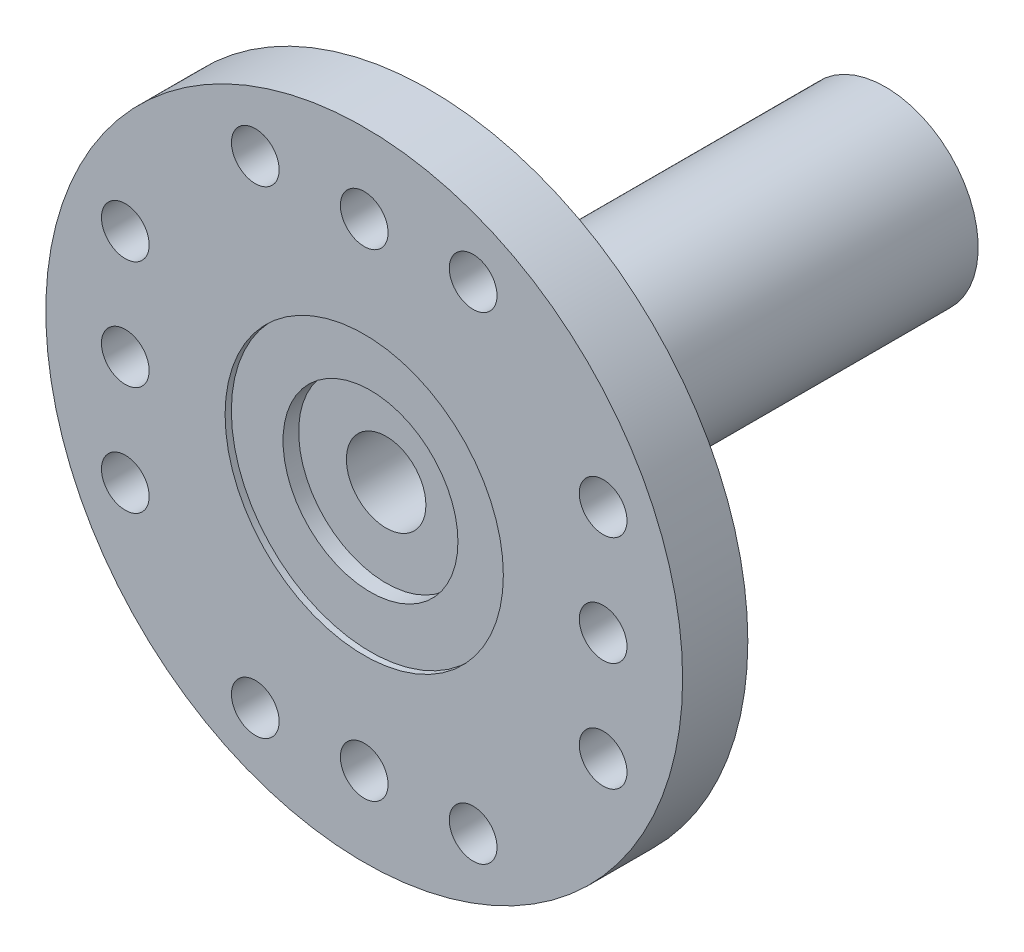
ISO-10303-21;
HEADER;
FILE_DESCRIPTION(('STEP AP214'),'2;1');
FILE_NAME('part.step','',(''),(''),'','','');
FILE_SCHEMA(('AUTOMOTIVE_DESIGN { 1 0 10303 214 1 1 1 1 }'));
ENDSEC;
DATA;
#1=APPLICATION_CONTEXT('core data for automotive mechanical design processes');
#2=APPLICATION_PROTOCOL_DEFINITION('international standard','automotive_design',2000,#1);
#3=PRODUCT_CONTEXT('',#1,'mechanical');
#4=PRODUCT('Part','Part','',(#3));
#5=PRODUCT_RELATED_PRODUCT_CATEGORY('part','',(#4));
#6=PRODUCT_DEFINITION_FORMATION('','',#4);
#7=PRODUCT_DEFINITION_CONTEXT('part definition',#1,'design');
#8=PRODUCT_DEFINITION('design','',#6,#7);
#9=PRODUCT_DEFINITION_SHAPE('','',#8);
#10=(LENGTH_UNIT() NAMED_UNIT(*) SI_UNIT(.MILLI.,.METRE.));
#11=(NAMED_UNIT(*) PLANE_ANGLE_UNIT() SI_UNIT($,.RADIAN.));
#12=(NAMED_UNIT(*) SI_UNIT($,.STERADIAN.) SOLID_ANGLE_UNIT());
#13=UNCERTAINTY_MEASURE_WITH_UNIT(LENGTH_MEASURE(1.E-05),#10,'distance_accuracy_value','');
#14=(GEOMETRIC_REPRESENTATION_CONTEXT(3) GLOBAL_UNCERTAINTY_ASSIGNED_CONTEXT((#13)) GLOBAL_UNIT_ASSIGNED_CONTEXT((#10,
#11,#12)) REPRESENTATION_CONTEXT('',''));
#15=CARTESIAN_POINT('',(0.,0.,0.));
#16=DIRECTION('',(0.,0.,1.));
#17=DIRECTION('',(1.,0.,0.));
#18=AXIS2_PLACEMENT_3D('',#15,#16,#17);
#19=CARTESIAN_POINT('',(0.,0.,-3.302));
#20=DIRECTION('',(0.,0.,-1.));
#21=DIRECTION('',(-1.,0.,0.));
#22=AXIS2_PLACEMENT_3D('',#19,#20,#21);
#23=PLANE('',#22);
#24=CARTESIAN_POINT('',(0.,0.,-3.302));
#25=DIRECTION('',(0.,0.,-1.));
#26=DIRECTION('',(-1.,0.,0.));
#27=AXIS2_PLACEMENT_3D('',#24,#25,#26);
#28=CIRCLE('',#27,4.699);
#29=CARTESIAN_POINT('',(4.699,0.,-3.302));
#30=VERTEX_POINT('',#29);
#31=EDGE_CURVE('E46',#30,#30,#28,.T.);
#32=ORIENTED_EDGE('',*,*,#31,.T.);
#33=EDGE_LOOP('',(#32));
#34=FACE_BOUND('',#33,.T.);
#35=CARTESIAN_POINT('',(0.,0.,-3.302));
#36=DIRECTION('',(0.,0.,-1.));
#37=DIRECTION('',(-1.,0.,0.));
#38=AXIS2_PLACEMENT_3D('',#35,#36,#37);
#39=CIRCLE('',#38,2.9591);
#40=CARTESIAN_POINT('',(-2.9591,0.,-3.302));
#41=VERTEX_POINT('',#40);
#42=EDGE_CURVE('E51',#41,#41,#39,.T.);
#43=ORIENTED_EDGE('',*,*,#42,.F.);
#44=EDGE_LOOP('',(#43));
#45=FACE_BOUND('',#44,.T.);
#46=ADVANCED_FACE('F30',(#34,#45),#23,.T.);
#47=CARTESIAN_POINT('',(0.,0.,0.));
#48=DIRECTION('',(0.,0.,1.));
#49=DIRECTION('',(1.,0.,0.));
#50=AXIS2_PLACEMENT_3D('',#47,#48,#49);
#51=PLANE('',#50);
#52=CARTESIAN_POINT('',(3.47980000000008,-7.63269999999996,0.));
#53=DIRECTION('',(0.,0.,1.));
#54=DIRECTION('',(1.,0.,0.));
#55=AXIS2_PLACEMENT_3D('',#52,#53,#54);
#56=CIRCLE('',#55,0.762000000000002);
#57=CARTESIAN_POINT('',(4.24180000000008,-7.63269999999996,0.));
#58=VERTEX_POINT('',#57);
#59=EDGE_CURVE('E140',#58,#58,#56,.F.);
#60=ORIENTED_EDGE('',*,*,#59,.F.);
#61=EDGE_LOOP('',(#60));
#62=FACE_BOUND('',#61,.T.);
#63=CARTESIAN_POINT('',(-3.47979999999992,-7.63270000000004,0.));
#64=DIRECTION('',(0.,0.,1.));
#65=DIRECTION('',(1.,0.,0.));
#66=AXIS2_PLACEMENT_3D('',#63,#64,#65);
#67=CIRCLE('',#66,0.762000000000001);
#68=CARTESIAN_POINT('',(-2.71779999999992,-7.63270000000004,0.));
#69=VERTEX_POINT('',#68);
#70=EDGE_CURVE('E134',#69,#69,#67,.F.);
#71=ORIENTED_EDGE('',*,*,#70,.F.);
#72=EDGE_LOOP('',(#71));
#73=FACE_BOUND('',#72,.T.);
#74=CARTESIAN_POINT('',(0.,-7.6327,0.));
#75=DIRECTION('',(0.,0.,1.));
#76=DIRECTION('',(1.,0.,0.));
#77=AXIS2_PLACEMENT_3D('',#74,#75,#76);
#78=CIRCLE('',#77,0.762000000000001);
#79=CARTESIAN_POINT('',(0.762000000000081,-7.6327,0.));
#80=VERTEX_POINT('',#79);
#81=EDGE_CURVE('E128',#80,#80,#78,.F.);
#82=ORIENTED_EDGE('',*,*,#81,.F.);
#83=EDGE_LOOP('',(#82));
#84=FACE_BOUND('',#83,.T.);
#85=CARTESIAN_POINT('',(-7.63269999999998,-3.47980000000005,0.));
#86=DIRECTION('',(0.,0.,1.));
#87=DIRECTION('',(1.,0.,0.));
#88=AXIS2_PLACEMENT_3D('',#85,#86,#87);
#89=CIRCLE('',#88,0.762000000000002);
#90=CARTESIAN_POINT('',(-6.87069999999997,-3.47980000000005,0.));
#91=VERTEX_POINT('',#90);
#92=EDGE_CURVE('E122',#91,#91,#89,.F.);
#93=ORIENTED_EDGE('',*,*,#92,.F.);
#94=EDGE_LOOP('',(#93));
#95=FACE_BOUND('',#94,.T.);
#96=CARTESIAN_POINT('',(-7.63270000000002,3.47979999999995,0.));
#97=DIRECTION('',(0.,0.,1.));
#98=DIRECTION('',(1.,0.,0.));
#99=AXIS2_PLACEMENT_3D('',#96,#97,#98);
#100=CIRCLE('',#99,0.762000000000001);
#101=CARTESIAN_POINT('',(-6.87070000000002,3.47979999999995,0.));
#102=VERTEX_POINT('',#101);
#103=EDGE_CURVE('E116',#102,#102,#100,.F.);
#104=ORIENTED_EDGE('',*,*,#103,.F.);
#105=EDGE_LOOP('',(#104));
#106=FACE_BOUND('',#105,.T.);
#107=CARTESIAN_POINT('',(-7.6327,0.,0.));
#108=DIRECTION('',(0.,0.,1.));
#109=DIRECTION('',(1.,0.,0.));
#110=AXIS2_PLACEMENT_3D('',#107,#108,#109);
#111=CIRCLE('',#110,0.762000000000001);
#112=CARTESIAN_POINT('',(-6.8707,0.,0.));
#113=VERTEX_POINT('',#112);
#114=EDGE_CURVE('E110',#113,#113,#111,.F.);
#115=ORIENTED_EDGE('',*,*,#114,.F.);
#116=EDGE_LOOP('',(#115));
#117=FACE_BOUND('',#116,.T.);
#118=CARTESIAN_POINT('',(-3.47980000000003,7.63269999999999,0.));
#119=DIRECTION('',(0.,0.,1.));
#120=DIRECTION('',(1.,0.,0.));
#121=AXIS2_PLACEMENT_3D('',#118,#119,#120);
#122=CIRCLE('',#121,0.762000000000002);
#123=CARTESIAN_POINT('',(-2.71780000000002,7.63269999999999,0.));
#124=VERTEX_POINT('',#123);
#125=EDGE_CURVE('E104',#124,#124,#122,.F.);
#126=ORIENTED_EDGE('',*,*,#125,.F.);
#127=EDGE_LOOP('',(#126));
#128=FACE_BOUND('',#127,.T.);
#129=CARTESIAN_POINT('',(3.47979999999997,7.63270000000001,0.));
#130=DIRECTION('',(0.,0.,1.));
#131=DIRECTION('',(1.,0.,0.));
#132=AXIS2_PLACEMENT_3D('',#129,#130,#131);
#133=CIRCLE('',#132,0.762000000000001);
#134=CARTESIAN_POINT('',(4.24179999999997,7.63270000000001,0.));
#135=VERTEX_POINT('',#134);
#136=EDGE_CURVE('E98',#135,#135,#133,.F.);
#137=ORIENTED_EDGE('',*,*,#136,.F.);
#138=EDGE_LOOP('',(#137));
#139=FACE_BOUND('',#138,.T.);
#140=CARTESIAN_POINT('',(0.,7.6327,0.));
#141=DIRECTION('',(0.,0.,1.));
#142=DIRECTION('',(1.,0.,0.));
#143=AXIS2_PLACEMENT_3D('',#140,#141,#142);
#144=CIRCLE('',#143,0.762000000000001);
#145=CARTESIAN_POINT('',(0.761999999999974,7.6327,0.));
#146=VERTEX_POINT('',#145);
#147=EDGE_CURVE('E92',#146,#146,#144,.F.);
#148=ORIENTED_EDGE('',*,*,#147,.F.);
#149=EDGE_LOOP('',(#148));
#150=FACE_BOUND('',#149,.T.);
#151=CARTESIAN_POINT('',(7.6327,3.4798,0.));
#152=DIRECTION('',(0.,0.,1.));
#153=DIRECTION('',(1.,0.,0.));
#154=AXIS2_PLACEMENT_3D('',#151,#152,#153);
#155=CIRCLE('',#154,0.762000000000002);
#156=CARTESIAN_POINT('',(8.3947,3.4798,0.));
#157=VERTEX_POINT('',#156);
#158=EDGE_CURVE('E86',#157,#157,#155,.F.);
#159=ORIENTED_EDGE('',*,*,#158,.F.);
#160=EDGE_LOOP('',(#159));
#161=FACE_BOUND('',#160,.T.);
#162=CARTESIAN_POINT('',(7.6327,-3.4798,0.));
#163=DIRECTION('',(0.,0.,1.));
#164=DIRECTION('',(1.,0.,0.));
#165=AXIS2_PLACEMENT_3D('',#162,#163,#164);
#166=CIRCLE('',#165,0.762000000000001);
#167=CARTESIAN_POINT('',(8.3947,-3.4798,0.));
#168=VERTEX_POINT('',#167);
#169=EDGE_CURVE('E80',#168,#168,#166,.F.);
#170=ORIENTED_EDGE('',*,*,#169,.F.);
#171=EDGE_LOOP('',(#170));
#172=FACE_BOUND('',#171,.T.);
#173=CARTESIAN_POINT('',(7.6327,0.,0.));
#174=DIRECTION('',(0.,0.,1.));
#175=DIRECTION('',(1.,0.,0.));
#176=AXIS2_PLACEMENT_3D('',#173,#174,#175);
#177=CIRCLE('',#176,0.762000000000001);
#178=CARTESIAN_POINT('',(8.3947,0.,0.));
#179=VERTEX_POINT('',#178);
#180=EDGE_CURVE('E72',#179,#179,#177,.F.);
#181=ORIENTED_EDGE('',*,*,#180,.F.);
#182=EDGE_LOOP('',(#181));
#183=FACE_BOUND('',#182,.T.);
#184=CARTESIAN_POINT('',(0.,0.,0.));
#185=DIRECTION('',(0.,0.,1.));
#186=DIRECTION('',(1.,0.,0.));
#187=AXIS2_PLACEMENT_3D('',#184,#185,#186);
#188=CIRCLE('',#187,10.1727);
#189=CARTESIAN_POINT('',(10.1727,0.,0.));
#190=VERTEX_POINT('',#189);
#191=EDGE_CURVE('E41',#190,#190,#188,.T.);
#192=ORIENTED_EDGE('',*,*,#191,.F.);
#193=EDGE_LOOP('',(#192));
#194=FACE_BOUND('',#193,.T.);
#195=CARTESIAN_POINT('',(0.,0.,0.));
#196=DIRECTION('',(0.,0.,1.));
#197=DIRECTION('',(1.,0.,0.));
#198=AXIS2_PLACEMENT_3D('',#195,#196,#197);
#199=CIRCLE('',#198,4.699);
#200=CARTESIAN_POINT('',(4.699,0.,0.));
#201=VERTEX_POINT('',#200);
#202=EDGE_CURVE('E10',#201,#201,#199,.F.);
#203=ORIENTED_EDGE('',*,*,#202,.F.);
#204=EDGE_LOOP('',(#203));
#205=FACE_BOUND('',#204,.T.);
#206=ADVANCED_FACE('F197',(#62,#73,#84,#95,#106,#117,#128,#139,#150,#161,#172,#183,#194,#205),
#51,.F.);
#207=CARTESIAN_POINT('',(0.,0.,2.0828));
#208=DIRECTION('',(0.,0.,-1.));
#209=DIRECTION('',(-1.,0.,0.));
#210=AXIS2_PLACEMENT_3D('',#207,#208,#209);
#211=CYLINDRICAL_SURFACE('',#210,10.1727);
#212=CARTESIAN_POINT('',(0.,0.,2.0828));
#213=DIRECTION('',(0.,0.,1.));
#214=DIRECTION('',(1.,0.,0.));
#215=AXIS2_PLACEMENT_3D('',#212,#213,#214);
#216=CIRCLE('',#215,10.1727);
#217=CARTESIAN_POINT('',(10.1727,0.,2.0828));
#218=VERTEX_POINT('',#217);
#219=EDGE_CURVE('E37',#218,#218,#216,.T.);
#220=ORIENTED_EDGE('',*,*,#219,.F.);
#221=EDGE_LOOP('',(#220));
#222=FACE_BOUND('',#221,.T.);
#223=ORIENTED_EDGE('',*,*,#191,.T.);
#224=EDGE_LOOP('',(#223));
#225=FACE_BOUND('',#224,.T.);
#226=ADVANCED_FACE('F32',(#222,#225),#211,.T.);
#227=CARTESIAN_POINT('',(0.,0.,2.0828));
#228=DIRECTION('',(0.,0.,1.));
#229=DIRECTION('',(1.,0.,0.));
#230=AXIS2_PLACEMENT_3D('',#227,#228,#229);
#231=PLANE('',#230);
#232=CARTESIAN_POINT('',(3.47980000000008,-7.63269999999996,2.0828));
#233=DIRECTION('',(0.,0.,1.));
#234=DIRECTION('',(0.,-1.,0.));
#235=AXIS2_PLACEMENT_3D('',#232,#233,#234);
#236=CIRCLE('',#235,0.762000000000002);
#237=CARTESIAN_POINT('',(3.47980000000009,-8.39469999999996,2.0828));
#238=VERTEX_POINT('',#237);
#239=EDGE_CURVE('E143',#238,#238,#236,.T.);
#240=ORIENTED_EDGE('',*,*,#239,.F.);
#241=EDGE_LOOP('',(#240));
#242=FACE_BOUND('',#241,.T.);
#243=CARTESIAN_POINT('',(-3.47979999999992,-7.63270000000004,2.0828));
#244=DIRECTION('',(0.,0.,1.));
#245=DIRECTION('',(0.,-1.,0.));
#246=AXIS2_PLACEMENT_3D('',#243,#244,#245);
#247=CIRCLE('',#246,0.762000000000001);
#248=CARTESIAN_POINT('',(-3.47979999999991,-8.39470000000004,2.0828));
#249=VERTEX_POINT('',#248);
#250=EDGE_CURVE('E137',#249,#249,#247,.T.);
#251=ORIENTED_EDGE('',*,*,#250,.F.);
#252=EDGE_LOOP('',(#251));
#253=FACE_BOUND('',#252,.T.);
#254=CARTESIAN_POINT('',(0.,-7.6327,2.0828));
#255=DIRECTION('',(0.,0.,1.));
#256=DIRECTION('',(0.,-1.,0.));
#257=AXIS2_PLACEMENT_3D('',#254,#255,#256);
#258=CIRCLE('',#257,0.762000000000001);
#259=CARTESIAN_POINT('',(0.,-8.3947,2.0828));
#260=VERTEX_POINT('',#259);
#261=EDGE_CURVE('E131',#260,#260,#258,.T.);
#262=ORIENTED_EDGE('',*,*,#261,.F.);
#263=EDGE_LOOP('',(#262));
#264=FACE_BOUND('',#263,.T.);
#265=CARTESIAN_POINT('',(-7.63269999999998,-3.47980000000005,2.0828));
#266=DIRECTION('',(0.,0.,1.));
#267=DIRECTION('',(-1.,0.,0.));
#268=AXIS2_PLACEMENT_3D('',#265,#266,#267);
#269=CIRCLE('',#268,0.762000000000002);
#270=CARTESIAN_POINT('',(-8.39469999999998,-3.47980000000006,2.0828));
#271=VERTEX_POINT('',#270);
#272=EDGE_CURVE('E125',#271,#271,#269,.T.);
#273=ORIENTED_EDGE('',*,*,#272,.F.);
#274=EDGE_LOOP('',(#273));
#275=FACE_BOUND('',#274,.T.);
#276=CARTESIAN_POINT('',(-7.63270000000002,3.47979999999995,2.0828));
#277=DIRECTION('',(0.,0.,1.));
#278=DIRECTION('',(-1.,0.,0.));
#279=AXIS2_PLACEMENT_3D('',#276,#277,#278);
#280=CIRCLE('',#279,0.762000000000001);
#281=CARTESIAN_POINT('',(-8.39470000000002,3.47979999999994,2.0828));
#282=VERTEX_POINT('',#281);
#283=EDGE_CURVE('E119',#282,#282,#280,.T.);
#284=ORIENTED_EDGE('',*,*,#283,.F.);
#285=EDGE_LOOP('',(#284));
#286=FACE_BOUND('',#285,.T.);
#287=CARTESIAN_POINT('',(-7.6327,0.,2.0828));
#288=DIRECTION('',(0.,0.,1.));
#289=DIRECTION('',(-1.,0.,0.));
#290=AXIS2_PLACEMENT_3D('',#287,#288,#289);
#291=CIRCLE('',#290,0.762000000000001);
#292=CARTESIAN_POINT('',(-8.3947,0.,2.0828));
#293=VERTEX_POINT('',#292);
#294=EDGE_CURVE('E113',#293,#293,#291,.T.);
#295=ORIENTED_EDGE('',*,*,#294,.F.);
#296=EDGE_LOOP('',(#295));
#297=FACE_BOUND('',#296,.T.);
#298=CARTESIAN_POINT('',(-3.47980000000003,7.63269999999999,2.0828));
#299=DIRECTION('',(0.,0.,1.));
#300=DIRECTION('',(0.,1.,0.));
#301=AXIS2_PLACEMENT_3D('',#298,#299,#300);
#302=CIRCLE('',#301,0.762000000000002);
#303=CARTESIAN_POINT('',(-3.47980000000003,8.39469999999999,2.0828));
#304=VERTEX_POINT('',#303);
#305=EDGE_CURVE('E107',#304,#304,#302,.T.);
#306=ORIENTED_EDGE('',*,*,#305,.F.);
#307=EDGE_LOOP('',(#306));
#308=FACE_BOUND('',#307,.T.);
#309=CARTESIAN_POINT('',(3.47979999999997,7.63270000000001,2.0828));
#310=DIRECTION('',(0.,0.,1.));
#311=DIRECTION('',(0.,1.,0.));
#312=AXIS2_PLACEMENT_3D('',#309,#310,#311);
#313=CIRCLE('',#312,0.762000000000001);
#314=CARTESIAN_POINT('',(3.47979999999997,8.39470000000001,2.0828));
#315=VERTEX_POINT('',#314);
#316=EDGE_CURVE('E101',#315,#315,#313,.T.);
#317=ORIENTED_EDGE('',*,*,#316,.F.);
#318=EDGE_LOOP('',(#317));
#319=FACE_BOUND('',#318,.T.);
#320=CARTESIAN_POINT('',(0.,7.6327,2.0828));
#321=DIRECTION('',(0.,0.,1.));
#322=DIRECTION('',(0.,1.,0.));
#323=AXIS2_PLACEMENT_3D('',#320,#321,#322);
#324=CIRCLE('',#323,0.762000000000001);
#325=CARTESIAN_POINT('',(0.,8.3947,2.0828));
#326=VERTEX_POINT('',#325);
#327=EDGE_CURVE('E95',#326,#326,#324,.T.);
#328=ORIENTED_EDGE('',*,*,#327,.F.);
#329=EDGE_LOOP('',(#328));
#330=FACE_BOUND('',#329,.T.);
#331=CARTESIAN_POINT('',(7.6327,3.4798,2.0828));
#332=DIRECTION('',(0.,0.,1.));
#333=DIRECTION('',(1.,0.,0.));
#334=AXIS2_PLACEMENT_3D('',#331,#332,#333);
#335=CIRCLE('',#334,0.762000000000002);
#336=CARTESIAN_POINT('',(8.3947,3.4798,2.0828));
#337=VERTEX_POINT('',#336);
#338=EDGE_CURVE('E89',#337,#337,#335,.T.);
#339=ORIENTED_EDGE('',*,*,#338,.F.);
#340=EDGE_LOOP('',(#339));
#341=FACE_BOUND('',#340,.T.);
#342=CARTESIAN_POINT('',(7.6327,-3.4798,2.0828));
#343=DIRECTION('',(0.,0.,1.));
#344=DIRECTION('',(1.,0.,0.));
#345=AXIS2_PLACEMENT_3D('',#342,#343,#344);
#346=CIRCLE('',#345,0.762000000000001);
#347=CARTESIAN_POINT('',(8.3947,-3.4798,2.0828));
#348=VERTEX_POINT('',#347);
#349=EDGE_CURVE('E83',#348,#348,#346,.T.);
#350=ORIENTED_EDGE('',*,*,#349,.F.);
#351=EDGE_LOOP('',(#350));
#352=FACE_BOUND('',#351,.T.);
#353=CARTESIAN_POINT('',(7.6327,0.,2.0828));
#354=DIRECTION('',(0.,0.,1.));
#355=DIRECTION('',(1.,0.,0.));
#356=AXIS2_PLACEMENT_3D('',#353,#354,#355);
#357=CIRCLE('',#356,0.762000000000001);
#358=CARTESIAN_POINT('',(8.3947,0.,2.0828));
#359=VERTEX_POINT('',#358);
#360=EDGE_CURVE('E77',#359,#359,#357,.T.);
#361=ORIENTED_EDGE('',*,*,#360,.F.);
#362=EDGE_LOOP('',(#361));
#363=FACE_BOUND('',#362,.T.);
#364=CARTESIAN_POINT('',(0.,0.,2.0828));
#365=DIRECTION('',(0.,0.,1.));
#366=DIRECTION('',(1.,0.,0.));
#367=AXIS2_PLACEMENT_3D('',#364,#365,#366);
#368=CIRCLE('',#367,4.445);
#369=CARTESIAN_POINT('',(4.445,0.,2.0828));
#370=VERTEX_POINT('',#369);
#371=EDGE_CURVE('E57',#370,#370,#368,.T.);
#372=ORIENTED_EDGE('',*,*,#371,.F.);
#373=EDGE_LOOP('',(#372));
#374=FACE_BOUND('',#373,.T.);
#375=ORIENTED_EDGE('',*,*,#219,.T.);
#376=EDGE_LOOP('',(#375));
#377=FACE_BOUND('',#376,.T.);
#378=ADVANCED_FACE('F150',(#242,#253,#264,#275,#286,#297,#308,#319,#330,#341,#352,#363,#374,
#377),#231,.T.);
#379=CARTESIAN_POINT('',(0.,0.,-3.302));
#380=DIRECTION('',(0.,0.,1.));
#381=DIRECTION('',(1.,0.,0.));
#382=AXIS2_PLACEMENT_3D('',#379,#380,#381);
#383=CYLINDRICAL_SURFACE('',#382,4.699);
#384=CARTESIAN_POINT('',(4.699,0.,-3.302));
#385=CARTESIAN_POINT('',(4.699,0.,-3.26760416666667));
#386=CARTESIAN_POINT('',(4.699,0.,-3.23320833333333));
#387=CARTESIAN_POINT('',(4.699,0.,-3.16441666666667));
#388=CARTESIAN_POINT('',(4.699,0.,-3.13002083333333));
#389=CARTESIAN_POINT('',(4.699,0.,-3.06122916666667));
#390=CARTESIAN_POINT('',(4.699,0.,-3.02683333333333));
#391=CARTESIAN_POINT('',(4.699,0.,-2.95804166666667));
#392=CARTESIAN_POINT('',(4.699,0.,-2.92364583333333));
#393=CARTESIAN_POINT('',(4.699,0.,-2.85485416666667));
#394=CARTESIAN_POINT('',(4.699,0.,-2.82045833333333));
#395=CARTESIAN_POINT('',(4.699,0.,-2.75166666666667));
#396=CARTESIAN_POINT('',(4.699,0.,-2.71727083333333));
#397=CARTESIAN_POINT('',(4.699,0.,-2.64847916666667));
#398=CARTESIAN_POINT('',(4.699,0.,-2.61408333333333));
#399=CARTESIAN_POINT('',(4.699,0.,-2.54529166666667));
#400=CARTESIAN_POINT('',(4.699,0.,-2.51089583333333));
#401=CARTESIAN_POINT('',(4.699,0.,-2.44210416666667));
#402=CARTESIAN_POINT('',(4.699,0.,-2.40770833333333));
#403=CARTESIAN_POINT('',(4.699,0.,-2.33891666666667));
#404=CARTESIAN_POINT('',(4.699,0.,-2.30452083333333));
#405=CARTESIAN_POINT('',(4.699,0.,-2.23572916666667));
#406=CARTESIAN_POINT('',(4.699,0.,-2.20133333333333));
#407=CARTESIAN_POINT('',(4.699,0.,-2.13254166666667));
#408=CARTESIAN_POINT('',(4.699,0.,-2.09814583333333));
#409=CARTESIAN_POINT('',(4.699,0.,-2.02935416666667));
#410=CARTESIAN_POINT('',(4.699,0.,-1.99495833333333));
#411=CARTESIAN_POINT('',(4.699,0.,-1.92616666666667));
#412=CARTESIAN_POINT('',(4.699,0.,-1.89177083333333));
#413=CARTESIAN_POINT('',(4.699,0.,-1.82297916666667));
#414=CARTESIAN_POINT('',(4.699,0.,-1.78858333333333));
#415=CARTESIAN_POINT('',(4.699,0.,-1.71979166666667));
#416=CARTESIAN_POINT('',(4.699,0.,-1.68539583333333));
#417=CARTESIAN_POINT('',(4.699,0.,-1.61660416666667));
#418=CARTESIAN_POINT('',(4.699,0.,-1.58220833333333));
#419=CARTESIAN_POINT('',(4.699,0.,-1.51341666666667));
#420=CARTESIAN_POINT('',(4.699,0.,-1.47902083333333));
#421=CARTESIAN_POINT('',(4.699,0.,-1.41022916666667));
#422=CARTESIAN_POINT('',(4.699,0.,-1.37583333333333));
#423=CARTESIAN_POINT('',(4.699,0.,-1.30704166666667));
#424=CARTESIAN_POINT('',(4.699,0.,-1.27264583333333));
#425=CARTESIAN_POINT('',(4.699,0.,-1.20385416666667));
#426=CARTESIAN_POINT('',(4.699,0.,-1.16945833333333));
#427=CARTESIAN_POINT('',(4.699,0.,-1.10066666666667));
#428=CARTESIAN_POINT('',(4.699,0.,-1.06627083333333));
#429=CARTESIAN_POINT('',(4.699,0.,-0.997479166666667));
#430=CARTESIAN_POINT('',(4.699,0.,-0.963083333333334));
#431=CARTESIAN_POINT('',(4.699,0.,-0.894291666666667));
#432=CARTESIAN_POINT('',(4.699,0.,-0.859895833333333));
#433=CARTESIAN_POINT('',(4.699,0.,-0.791104166666666));
#434=CARTESIAN_POINT('',(4.699,0.,-0.756708333333333));
#435=CARTESIAN_POINT('',(4.699,0.,-0.687916666666667));
#436=CARTESIAN_POINT('',(4.699,0.,-0.653520833333333));
#437=CARTESIAN_POINT('',(4.699,0.,-0.584729166666667));
#438=CARTESIAN_POINT('',(4.699,0.,-0.550333333333333));
#439=CARTESIAN_POINT('',(4.699,0.,-0.481541666666667));
#440=CARTESIAN_POINT('',(4.699,0.,-0.447145833333333));
#441=CARTESIAN_POINT('',(4.699,0.,-0.378354166666667));
#442=CARTESIAN_POINT('',(4.699,0.,-0.343958333333333));
#443=CARTESIAN_POINT('',(4.699,0.,-0.275166666666667));
#444=CARTESIAN_POINT('',(4.699,0.,-0.240770833333333));
#445=CARTESIAN_POINT('',(4.699,0.,-0.171979166666667));
#446=CARTESIAN_POINT('',(4.699,0.,-0.137583333333333));
#447=CARTESIAN_POINT('',(4.699,0.,-0.0687916666666666));
#448=CARTESIAN_POINT('',(4.699,0.,-0.0343958333333333));
#449=CARTESIAN_POINT('',(4.699,0.,0.));
#450=B_SPLINE_CURVE_WITH_KNOTS('',3,(#384,#385,#386,#387,#388,#389,#390,#391,#392,#393,#394,
#395,#396,#397,#398,#399,#400,#401,#402,#403,#404,#405,#406,#407,#408,#409,#410,#411,#412,#413,
#414,#415,#416,#417,#418,#419,#420,#421,#422,#423,#424,#425,#426,#427,#428,#429,#430,#431,#432,
#433,#434,#435,#436,#437,#438,#439,#440,#441,#442,#443,#444,#445,#446,#447,#448,#449),
.UNSPECIFIED.,.F.,.F.,(4,2,2,2,2,2,2,2,2,2,2,2,2,2,2,2,2,2,2,2,2,2,2,2,2,2,2,2,2,2,2,2,4),(0.,
0.1031875,0.206375,0.3095625,0.41275,0.5159375,0.619125,0.7223125,0.8255,0.9286875,1.031875,
1.1350625,1.23825,1.3414375,1.444625,1.5478125,1.651,1.7541875,1.857375,1.9605625,2.06375,
2.1669375,2.270125,2.3733125,2.4765,2.5796875,2.682875,2.7860625,2.88925,2.9924375,3.095625,
3.1988125,3.302),.UNSPECIFIED.);
#451=EDGE_CURVE('BSEAM153',#30,#201,#450,.T.);
#452=ORIENTED_EDGE('',*,*,#31,.F.);
#453=ORIENTED_EDGE('',*,*,#202,.T.);
#454=ORIENTED_EDGE('',*,*,#451,.T.);
#455=ORIENTED_EDGE('',*,*,#451,.F.);
#456=EDGE_LOOP('',(#452,#454,#453,#455));
#457=FACE_BOUND('',#456,.T.);
#458=ADVANCED_FACE('F153',(#457),#383,.T.);
#459=CARTESIAN_POINT('',(0.,0.,-14.572));
#460=DIRECTION('',(0.,0.,1.));
#461=DIRECTION('',(1.,0.,0.));
#462=AXIS2_PLACEMENT_3D('',#459,#460,#461);
#463=CYLINDRICAL_SURFACE('',#462,2.9591);
#464=CARTESIAN_POINT('',(0.,0.,-14.572));
#465=DIRECTION('',(0.,0.,-1.));
#466=DIRECTION('',(-1.,0.,0.));
#467=AXIS2_PLACEMENT_3D('',#464,#465,#466);
#468=CIRCLE('',#467,2.9591);
#469=CARTESIAN_POINT('',(-2.9591,0.,-14.572));
#470=VERTEX_POINT('',#469);
#471=EDGE_CURVE('E50',#470,#470,#468,.T.);
#472=ORIENTED_EDGE('',*,*,#471,.F.);
#473=EDGE_LOOP('',(#472));
#474=FACE_BOUND('',#473,.T.);
#475=ORIENTED_EDGE('',*,*,#42,.T.);
#476=EDGE_LOOP('',(#475));
#477=FACE_BOUND('',#476,.T.);
#478=ADVANCED_FACE('F192',(#474,#477),#463,.T.);
#479=CARTESIAN_POINT('',(0.,0.,-14.572));
#480=DIRECTION('',(0.,0.,-1.));
#481=DIRECTION('',(-1.,0.,0.));
#482=AXIS2_PLACEMENT_3D('',#479,#480,#481);
#483=PLANE('',#482);
#484=CARTESIAN_POINT('',(0.,0.,-14.572));
#485=DIRECTION('',(0.,0.,1.));
#486=DIRECTION('',(1.,0.,0.));
#487=AXIS2_PLACEMENT_3D('',#484,#485,#486);
#488=CIRCLE('',#487,1.27);
#489=CARTESIAN_POINT('',(1.27,0.,-14.572));
#490=VERTEX_POINT('',#489);
#491=EDGE_CURVE('E66',#490,#490,#488,.T.);
#492=ORIENTED_EDGE('',*,*,#491,.T.);
#493=EDGE_LOOP('',(#492));
#494=FACE_BOUND('',#493,.T.);
#495=ORIENTED_EDGE('',*,*,#471,.T.);
#496=EDGE_LOOP('',(#495));
#497=FACE_BOUND('',#496,.T.);
#498=ADVANCED_FACE('F182',(#494,#497),#483,.T.);
#499=CARTESIAN_POINT('',(0.,0.,1.8828));
#500=DIRECTION('',(0.,0.,1.));
#501=DIRECTION('',(1.,0.,0.));
#502=AXIS2_PLACEMENT_3D('',#499,#500,#501);
#503=CYLINDRICAL_SURFACE('',#502,4.445);
#504=CARTESIAN_POINT('',(0.,0.,1.8828));
#505=DIRECTION('',(0.,0.,1.));
#506=DIRECTION('',(1.,0.,0.));
#507=AXIS2_PLACEMENT_3D('',#504,#505,#506);
#508=CIRCLE('',#507,4.445);
#509=CARTESIAN_POINT('',(4.445,0.,1.8828));
#510=VERTEX_POINT('',#509);
#511=EDGE_CURVE('E54',#510,#510,#508,.T.);
#512=ORIENTED_EDGE('',*,*,#511,.F.);
#513=EDGE_LOOP('',(#512));
#514=FACE_BOUND('',#513,.T.);
#515=ORIENTED_EDGE('',*,*,#371,.T.);
#516=EDGE_LOOP('',(#515));
#517=FACE_BOUND('',#516,.T.);
#518=ADVANCED_FACE('F179',(#514,#517),#503,.F.);
#519=CARTESIAN_POINT('',(0.,0.,1.8828));
#520=DIRECTION('',(0.,0.,1.));
#521=DIRECTION('',(1.,0.,0.));
#522=AXIS2_PLACEMENT_3D('',#519,#520,#521);
#523=PLANE('',#522);
#524=CARTESIAN_POINT('',(0.,0.,1.8828));
#525=DIRECTION('',(0.,0.,1.));
#526=DIRECTION('',(1.,0.,0.));
#527=AXIS2_PLACEMENT_3D('',#524,#525,#526);
#528=CIRCLE('',#527,2.794);
#529=CARTESIAN_POINT('',(2.794,0.,1.8828));
#530=VERTEX_POINT('',#529);
#531=EDGE_CURVE('E63',#530,#530,#528,.T.);
#532=ORIENTED_EDGE('',*,*,#531,.F.);
#533=EDGE_LOOP('',(#532));
#534=FACE_BOUND('',#533,.T.);
#535=ORIENTED_EDGE('',*,*,#511,.T.);
#536=EDGE_LOOP('',(#535));
#537=FACE_BOUND('',#536,.T.);
#538=ADVANCED_FACE('F181',(#534,#537),#523,.T.);
#539=CARTESIAN_POINT('',(0.,0.,1.3828));
#540=DIRECTION('',(0.,0.,1.));
#541=DIRECTION('',(1.,0.,0.));
#542=AXIS2_PLACEMENT_3D('',#539,#540,#541);
#543=CYLINDRICAL_SURFACE('',#542,2.794);
#544=CARTESIAN_POINT('',(0.,0.,1.3828));
#545=DIRECTION('',(0.,0.,1.));
#546=DIRECTION('',(1.,0.,0.));
#547=AXIS2_PLACEMENT_3D('',#544,#545,#546);
#548=CIRCLE('',#547,2.794);
#549=CARTESIAN_POINT('',(2.794,0.,1.3828));
#550=VERTEX_POINT('',#549);
#551=EDGE_CURVE('E60',#550,#550,#548,.T.);
#552=ORIENTED_EDGE('',*,*,#551,.F.);
#553=EDGE_LOOP('',(#552));
#554=FACE_BOUND('',#553,.T.);
#555=ORIENTED_EDGE('',*,*,#531,.T.);
#556=EDGE_LOOP('',(#555));
#557=FACE_BOUND('',#556,.T.);
#558=ADVANCED_FACE('F189',(#554,#557),#543,.F.);
#559=CARTESIAN_POINT('',(0.,0.,1.3828));
#560=DIRECTION('',(0.,0.,1.));
#561=DIRECTION('',(1.,0.,0.));
#562=AXIS2_PLACEMENT_3D('',#559,#560,#561);
#563=PLANE('',#562);
#564=CARTESIAN_POINT('',(0.,0.,1.3828));
#565=DIRECTION('',(0.,0.,1.));
#566=DIRECTION('',(1.,0.,0.));
#567=AXIS2_PLACEMENT_3D('',#564,#565,#566);
#568=CIRCLE('',#567,1.27);
#569=CARTESIAN_POINT('',(1.27,0.,1.3828));
#570=VERTEX_POINT('',#569);
#571=EDGE_CURVE('E69',#570,#570,#568,.T.);
#572=ORIENTED_EDGE('',*,*,#571,.F.);
#573=EDGE_LOOP('',(#572));
#574=FACE_BOUND('',#573,.T.);
#575=ORIENTED_EDGE('',*,*,#551,.T.);
#576=EDGE_LOOP('',(#575));
#577=FACE_BOUND('',#576,.T.);
#578=ADVANCED_FACE('F235',(#574,#577),#563,.T.);
#579=CARTESIAN_POINT('',(0.,0.,-14.572));
#580=DIRECTION('',(0.,0.,1.));
#581=DIRECTION('',(1.,0.,0.));
#582=AXIS2_PLACEMENT_3D('',#579,#580,#581);
#583=CYLINDRICAL_SURFACE('',#582,1.27);
#584=ORIENTED_EDGE('',*,*,#491,.F.);
#585=EDGE_LOOP('',(#584));
#586=FACE_BOUND('',#585,.T.);
#587=ORIENTED_EDGE('',*,*,#571,.T.);
#588=EDGE_LOOP('',(#587));
#589=FACE_BOUND('',#588,.T.);
#590=ADVANCED_FACE('F240',(#586,#589),#583,.F.);
#591=CARTESIAN_POINT('',(7.6327,0.,-14.573));
#592=DIRECTION('',(0.,0.,1.));
#593=DIRECTION('',(1.,0.,0.));
#594=AXIS2_PLACEMENT_3D('',#591,#592,#593);
#595=CYLINDRICAL_SURFACE('',#594,0.762000000000001);
#596=ORIENTED_EDGE('',*,*,#360,.T.);
#597=EDGE_LOOP('',(#596));
#598=FACE_BOUND('',#597,.T.);
#599=ORIENTED_EDGE('',*,*,#180,.T.);
#600=EDGE_LOOP('',(#599));
#601=FACE_BOUND('',#600,.T.);
#602=ADVANCED_FACE('F250',(#598,#601),#595,.F.);
#603=CARTESIAN_POINT('',(7.6327,-3.4798,-14.573));
#604=DIRECTION('',(0.,0.,1.));
#605=DIRECTION('',(1.,0.,0.));
#606=AXIS2_PLACEMENT_3D('',#603,#604,#605);
#607=CYLINDRICAL_SURFACE('',#606,0.762000000000001);
#608=ORIENTED_EDGE('',*,*,#349,.T.);
#609=EDGE_LOOP('',(#608));
#610=FACE_BOUND('',#609,.T.);
#611=ORIENTED_EDGE('',*,*,#169,.T.);
#612=EDGE_LOOP('',(#611));
#613=FACE_BOUND('',#612,.T.);
#614=ADVANCED_FACE('F260',(#610,#613),#607,.F.);
#615=CARTESIAN_POINT('',(7.6327,3.4798,-14.573));
#616=DIRECTION('',(0.,0.,1.));
#617=DIRECTION('',(1.,0.,0.));
#618=AXIS2_PLACEMENT_3D('',#615,#616,#617);
#619=CYLINDRICAL_SURFACE('',#618,0.762000000000002);
#620=ORIENTED_EDGE('',*,*,#338,.T.);
#621=EDGE_LOOP('',(#620));
#622=FACE_BOUND('',#621,.T.);
#623=ORIENTED_EDGE('',*,*,#158,.T.);
#624=EDGE_LOOP('',(#623));
#625=FACE_BOUND('',#624,.T.);
#626=ADVANCED_FACE('F270',(#622,#625),#619,.F.);
#627=CARTESIAN_POINT('',(0.,7.6327,-14.573));
#628=DIRECTION('',(0.,0.,1.));
#629=DIRECTION('',(1.,0.,0.));
#630=AXIS2_PLACEMENT_3D('',#627,#628,#629);
#631=CYLINDRICAL_SURFACE('',#630,0.762000000000001);
#632=ORIENTED_EDGE('',*,*,#327,.T.);
#633=EDGE_LOOP('',(#632));
#634=FACE_BOUND('',#633,.T.);
#635=ORIENTED_EDGE('',*,*,#147,.T.);
#636=EDGE_LOOP('',(#635));
#637=FACE_BOUND('',#636,.T.);
#638=ADVANCED_FACE('F280',(#634,#637),#631,.F.);
#639=CARTESIAN_POINT('',(3.47979999999997,7.63270000000001,-14.573));
#640=DIRECTION('',(0.,0.,1.));
#641=DIRECTION('',(1.,0.,0.));
#642=AXIS2_PLACEMENT_3D('',#639,#640,#641);
#643=CYLINDRICAL_SURFACE('',#642,0.762000000000001);
#644=ORIENTED_EDGE('',*,*,#316,.T.);
#645=EDGE_LOOP('',(#644));
#646=FACE_BOUND('',#645,.T.);
#647=ORIENTED_EDGE('',*,*,#136,.T.);
#648=EDGE_LOOP('',(#647));
#649=FACE_BOUND('',#648,.T.);
#650=ADVANCED_FACE('F305',(#646,#649),#643,.F.);
#651=CARTESIAN_POINT('',(-3.47980000000003,7.63269999999999,-14.573));
#652=DIRECTION('',(0.,0.,1.));
#653=DIRECTION('',(1.,0.,0.));
#654=AXIS2_PLACEMENT_3D('',#651,#652,#653);
#655=CYLINDRICAL_SURFACE('',#654,0.762000000000002);
#656=ORIENTED_EDGE('',*,*,#305,.T.);
#657=EDGE_LOOP('',(#656));
#658=FACE_BOUND('',#657,.T.);
#659=ORIENTED_EDGE('',*,*,#125,.T.);
#660=EDGE_LOOP('',(#659));
#661=FACE_BOUND('',#660,.T.);
#662=ADVANCED_FACE('F315',(#658,#661),#655,.F.);
#663=CARTESIAN_POINT('',(-7.6327,0.,-14.573));
#664=DIRECTION('',(0.,0.,1.));
#665=DIRECTION('',(1.,0.,0.));
#666=AXIS2_PLACEMENT_3D('',#663,#664,#665);
#667=CYLINDRICAL_SURFACE('',#666,0.762000000000001);
#668=ORIENTED_EDGE('',*,*,#294,.T.);
#669=EDGE_LOOP('',(#668));
#670=FACE_BOUND('',#669,.T.);
#671=ORIENTED_EDGE('',*,*,#114,.T.);
#672=EDGE_LOOP('',(#671));
#673=FACE_BOUND('',#672,.T.);
#674=ADVANCED_FACE('F325',(#670,#673),#667,.F.);
#675=CARTESIAN_POINT('',(-7.63270000000002,3.47979999999995,-14.573));
#676=DIRECTION('',(0.,0.,1.));
#677=DIRECTION('',(1.,0.,0.));
#678=AXIS2_PLACEMENT_3D('',#675,#676,#677);
#679=CYLINDRICAL_SURFACE('',#678,0.762000000000001);
#680=ORIENTED_EDGE('',*,*,#283,.T.);
#681=EDGE_LOOP('',(#680));
#682=FACE_BOUND('',#681,.T.);
#683=ORIENTED_EDGE('',*,*,#103,.T.);
#684=EDGE_LOOP('',(#683));
#685=FACE_BOUND('',#684,.T.);
#686=ADVANCED_FACE('F335',(#682,#685),#679,.F.);
#687=CARTESIAN_POINT('',(-7.63269999999998,-3.47980000000005,-14.573));
#688=DIRECTION('',(0.,0.,1.));
#689=DIRECTION('',(1.,0.,0.));
#690=AXIS2_PLACEMENT_3D('',#687,#688,#689);
#691=CYLINDRICAL_SURFACE('',#690,0.762000000000002);
#692=ORIENTED_EDGE('',*,*,#272,.T.);
#693=EDGE_LOOP('',(#692));
#694=FACE_BOUND('',#693,.T.);
#695=ORIENTED_EDGE('',*,*,#92,.T.);
#696=EDGE_LOOP('',(#695));
#697=FACE_BOUND('',#696,.T.);
#698=ADVANCED_FACE('F345',(#694,#697),#691,.F.);
#699=CARTESIAN_POINT('',(0.,-7.6327,-14.573));
#700=DIRECTION('',(0.,0.,1.));
#701=DIRECTION('',(1.,0.,0.));
#702=AXIS2_PLACEMENT_3D('',#699,#700,#701);
#703=CYLINDRICAL_SURFACE('',#702,0.762000000000001);
#704=ORIENTED_EDGE('',*,*,#261,.T.);
#705=EDGE_LOOP('',(#704));
#706=FACE_BOUND('',#705,.T.);
#707=ORIENTED_EDGE('',*,*,#81,.T.);
#708=EDGE_LOOP('',(#707));
#709=FACE_BOUND('',#708,.T.);
#710=ADVANCED_FACE('F355',(#706,#709),#703,.F.);
#711=CARTESIAN_POINT('',(-3.47979999999992,-7.63270000000004,-14.573));
#712=DIRECTION('',(0.,0.,1.));
#713=DIRECTION('',(1.,0.,0.));
#714=AXIS2_PLACEMENT_3D('',#711,#712,#713);
#715=CYLINDRICAL_SURFACE('',#714,0.762000000000001);
#716=ORIENTED_EDGE('',*,*,#250,.T.);
#717=EDGE_LOOP('',(#716));
#718=FACE_BOUND('',#717,.T.);
#719=ORIENTED_EDGE('',*,*,#70,.T.);
#720=EDGE_LOOP('',(#719));
#721=FACE_BOUND('',#720,.T.);
#722=ADVANCED_FACE('F365',(#718,#721),#715,.F.);
#723=CARTESIAN_POINT('',(3.47980000000008,-7.63269999999996,-14.573));
#724=DIRECTION('',(0.,0.,1.));
#725=DIRECTION('',(1.,0.,0.));
#726=AXIS2_PLACEMENT_3D('',#723,#724,#725);
#727=CYLINDRICAL_SURFACE('',#726,0.762000000000002);
#728=ORIENTED_EDGE('',*,*,#239,.T.);
#729=EDGE_LOOP('',(#728));
#730=FACE_BOUND('',#729,.T.);
#731=ORIENTED_EDGE('',*,*,#59,.T.);
#732=EDGE_LOOP('',(#731));
#733=FACE_BOUND('',#732,.T.);
#734=ADVANCED_FACE('F147',(#730,#733),#727,.F.);
#735=CLOSED_SHELL('',(#46,#206,#226,#378,#458,#478,#498,#518,#538,#558,#578,#590,#602,#614,#626,
#638,#650,#662,#674,#686,#698,#710,#722,#734));
#736=MANIFOLD_SOLID_BREP('B2',#735);
#737=ADVANCED_BREP_SHAPE_REPRESENTATION('',(#18,#736),#14);
#738=SHAPE_DEFINITION_REPRESENTATION(#9,#737);
ENDSEC;
END-ISO-10303-21;
